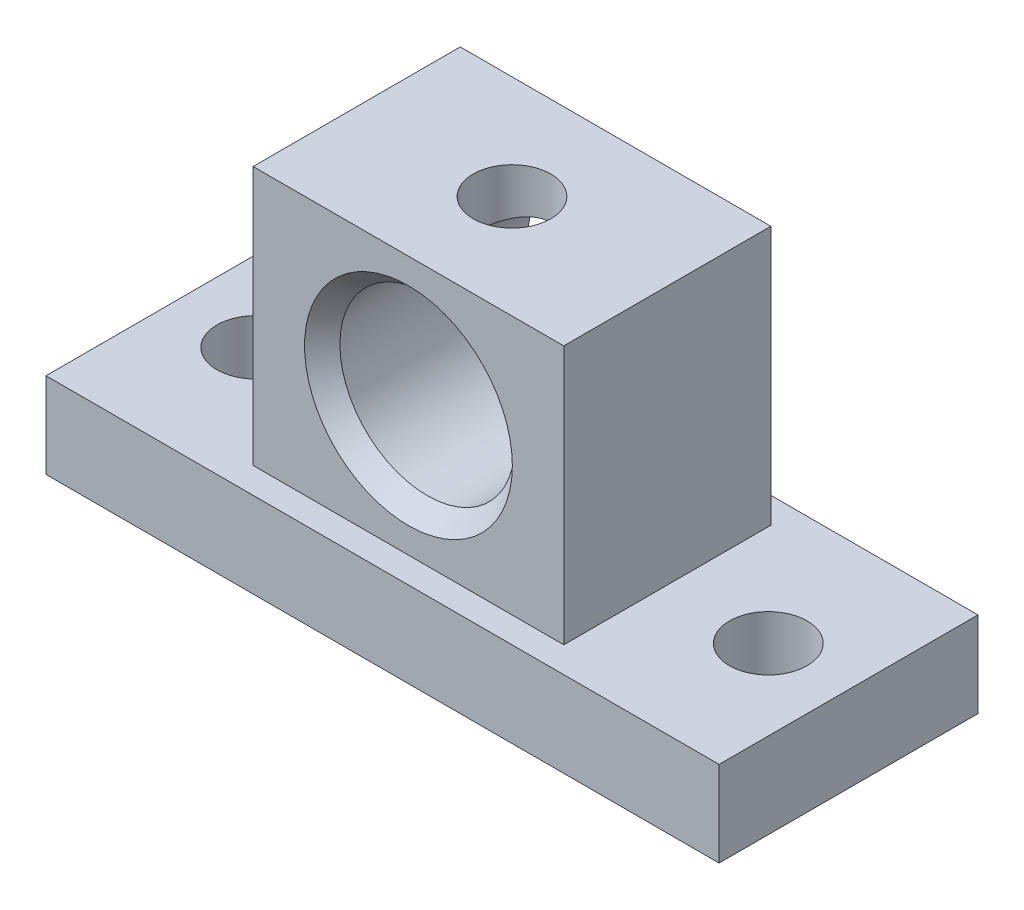
ISO-10303-21;
HEADER;
FILE_DESCRIPTION(('STEP AP214'),'2;1');
FILE_NAME('part.step','',(''),(''),'','','');
FILE_SCHEMA(('AUTOMOTIVE_DESIGN { 1 0 10303 214 1 1 1 1 }'));
ENDSEC;
DATA;
#1=APPLICATION_CONTEXT('core data for automotive mechanical design processes');
#2=APPLICATION_PROTOCOL_DEFINITION('international standard','automotive_design',2000,#1);
#3=PRODUCT_CONTEXT('',#1,'mechanical');
#4=PRODUCT('Part','Part','',(#3));
#5=PRODUCT_RELATED_PRODUCT_CATEGORY('part','',(#4));
#6=PRODUCT_DEFINITION_FORMATION('','',#4);
#7=PRODUCT_DEFINITION_CONTEXT('part definition',#1,'design');
#8=PRODUCT_DEFINITION('design','',#6,#7);
#9=PRODUCT_DEFINITION_SHAPE('','',#8);
#10=(LENGTH_UNIT() NAMED_UNIT(*) SI_UNIT(.MILLI.,.METRE.));
#11=(NAMED_UNIT(*) PLANE_ANGLE_UNIT() SI_UNIT($,.RADIAN.));
#12=(NAMED_UNIT(*) SI_UNIT($,.STERADIAN.) SOLID_ANGLE_UNIT());
#13=UNCERTAINTY_MEASURE_WITH_UNIT(LENGTH_MEASURE(1.E-05),#10,'distance_accuracy_value','');
#14=(GEOMETRIC_REPRESENTATION_CONTEXT(3) GLOBAL_UNCERTAINTY_ASSIGNED_CONTEXT((#13)) GLOBAL_UNIT_ASSIGNED_CONTEXT((#10,
#11,#12)) REPRESENTATION_CONTEXT('',''));
#15=CARTESIAN_POINT('',(0.,0.,0.));
#16=DIRECTION('',(0.,0.,1.));
#17=DIRECTION('',(1.,0.,0.));
#18=AXIS2_PLACEMENT_3D('',#15,#16,#17);
#19=CARTESIAN_POINT('',(0.,3.302,0.));
#20=DIRECTION('',(0.,-1.,0.));
#21=DIRECTION('',(0.,0.,-1.));
#22=AXIS2_PLACEMENT_3D('',#19,#20,#21);
#23=PLANE('',#22);
#24=CARTESIAN_POINT('',(9.9,3.302,0.));
#25=DIRECTION('',(0.,1.,0.));
#26=DIRECTION('',(0.,0.,1.));
#27=AXIS2_PLACEMENT_3D('',#24,#25,#26);
#28=CIRCLE('',#27,1.5);
#29=CARTESIAN_POINT('',(9.9,3.302,-1.5));
#30=VERTEX_POINT('',#29);
#31=EDGE_CURVE('E147',#30,#30,#28,.T.);
#32=ORIENTED_EDGE('',*,*,#31,.F.);
#33=EDGE_LOOP('',(#32));
#34=FACE_BOUND('',#33,.T.);
#35=CARTESIAN_POINT('',(-9.9,3.302,0.));
#36=DIRECTION('',(0.,1.,0.));
#37=DIRECTION('',(0.,0.,1.));
#38=AXIS2_PLACEMENT_3D('',#35,#36,#37);
#39=CIRCLE('',#38,1.5);
#40=CARTESIAN_POINT('',(-9.9,3.302,-1.5));
#41=VERTEX_POINT('',#40);
#42=EDGE_CURVE('E157',#41,#41,#39,.T.);
#43=ORIENTED_EDGE('',*,*,#42,.F.);
#44=EDGE_LOOP('',(#43));
#45=FACE_BOUND('',#44,.T.);
#46=DIRECTION('',(0.,0.,-1.));
#47=VECTOR('',#46,1.);
#48=CARTESIAN_POINT('',(13.,3.302,5.));
#49=LINE('',#48,#47);
#50=CARTESIAN_POINT('',(13.,3.302,5.));
#51=VERTEX_POINT('',#50);
#52=CARTESIAN_POINT('',(13.,3.302,-5.));
#53=VERTEX_POINT('',#52);
#54=EDGE_CURVE('E165',#51,#53,#49,.T.);
#55=ORIENTED_EDGE('',*,*,#54,.T.);
#56=DIRECTION('',(-1.,0.,0.));
#57=VECTOR('',#56,1.);
#58=CARTESIAN_POINT('',(-13.,3.302,-5.));
#59=LINE('',#58,#57);
#60=CARTESIAN_POINT('',(-13.,3.302,-5.));
#61=VERTEX_POINT('',#60);
#62=EDGE_CURVE('E169',#53,#61,#59,.T.);
#63=ORIENTED_EDGE('',*,*,#62,.T.);
#64=DIRECTION('',(0.,0.,1.));
#65=VECTOR('',#64,1.);
#66=CARTESIAN_POINT('',(-13.,3.302,5.));
#67=LINE('',#66,#65);
#68=CARTESIAN_POINT('',(-13.,3.302,5.));
#69=VERTEX_POINT('',#68);
#70=EDGE_CURVE('E173',#61,#69,#67,.T.);
#71=ORIENTED_EDGE('',*,*,#70,.T.);
#72=DIRECTION('',(1.,0.,0.));
#73=VECTOR('',#72,1.);
#74=CARTESIAN_POINT('',(-13.,3.302,5.));
#75=LINE('',#74,#73);
#76=EDGE_CURVE('E176',#69,#51,#75,.T.);
#77=ORIENTED_EDGE('',*,*,#76,.T.);
#78=EDGE_LOOP('',(#55,#63,#71,#77));
#79=FACE_BOUND('',#78,.T.);
#80=DIRECTION('',(0.,0.,-1.));
#81=VECTOR('',#80,1.);
#82=CARTESIAN_POINT('',(6.,3.302,-4.));
#83=LINE('',#82,#81);
#84=CARTESIAN_POINT('',(6.,3.302,4.));
#85=VERTEX_POINT('',#84);
#86=CARTESIAN_POINT('',(6.,3.302,-4.));
#87=VERTEX_POINT('',#86);
#88=EDGE_CURVE('E140',#85,#87,#83,.T.);
#89=ORIENTED_EDGE('',*,*,#88,.F.);
#90=DIRECTION('',(1.,0.,0.));
#91=VECTOR('',#90,1.);
#92=CARTESIAN_POINT('',(-6.,3.302,4.));
#93=LINE('',#92,#91);
#94=CARTESIAN_POINT('',(-6.,3.302,4.));
#95=VERTEX_POINT('',#94);
#96=EDGE_CURVE('E137',#95,#85,#93,.T.);
#97=ORIENTED_EDGE('',*,*,#96,.F.);
#98=DIRECTION('',(0.,0.,1.));
#99=VECTOR('',#98,1.);
#100=CARTESIAN_POINT('',(-6.,3.302,-4.));
#101=LINE('',#100,#99);
#102=CARTESIAN_POINT('',(-6.,3.302,-4.));
#103=VERTEX_POINT('',#102);
#104=EDGE_CURVE('E73',#103,#95,#101,.T.);
#105=ORIENTED_EDGE('',*,*,#104,.F.);
#106=DIRECTION('',(-1.,0.,0.));
#107=VECTOR('',#106,1.);
#108=CARTESIAN_POINT('',(-6.,3.302,-4.));
#109=LINE('',#108,#107);
#110=EDGE_CURVE('E68',#87,#103,#109,.T.);
#111=ORIENTED_EDGE('',*,*,#110,.F.);
#112=EDGE_LOOP('',(#89,#97,#105,#111));
#113=FACE_BOUND('',#112,.T.);
#114=ADVANCED_FACE('F45',(#34,#45,#79,#113),#23,.F.);
#115=CARTESIAN_POINT('',(0.,0.,0.));
#116=DIRECTION('',(0.,-1.,0.));
#117=DIRECTION('',(0.,0.,-1.));
#118=AXIS2_PLACEMENT_3D('',#115,#116,#117);
#119=PLANE('',#118);
#120=CARTESIAN_POINT('',(-9.9,0.,0.));
#121=DIRECTION('',(0.,1.,0.));
#122=DIRECTION('',(0.,0.,1.));
#123=AXIS2_PLACEMENT_3D('',#120,#121,#122);
#124=CIRCLE('',#123,1.5);
#125=CARTESIAN_POINT('',(-9.9,0.,-1.5));
#126=VERTEX_POINT('',#125);
#127=EDGE_CURVE('E155',#126,#126,#124,.T.);
#128=ORIENTED_EDGE('',*,*,#127,.T.);
#129=EDGE_LOOP('',(#128));
#130=FACE_BOUND('',#129,.T.);
#131=DIRECTION('',(0.,0.,-1.));
#132=VECTOR('',#131,1.);
#133=CARTESIAN_POINT('',(13.,0.,5.));
#134=LINE('',#133,#132);
#135=CARTESIAN_POINT('',(13.,0.,5.));
#136=VERTEX_POINT('',#135);
#137=CARTESIAN_POINT('',(13.,0.,-5.));
#138=VERTEX_POINT('',#137);
#139=EDGE_CURVE('E161',#136,#138,#134,.T.);
#140=ORIENTED_EDGE('',*,*,#139,.F.);
#141=DIRECTION('',(1.,0.,0.));
#142=VECTOR('',#141,1.);
#143=CARTESIAN_POINT('',(-13.,0.,5.));
#144=LINE('',#143,#142);
#145=CARTESIAN_POINT('',(-13.,0.,5.));
#146=VERTEX_POINT('',#145);
#147=EDGE_CURVE('E170',#146,#136,#144,.T.);
#148=ORIENTED_EDGE('',*,*,#147,.F.);
#149=DIRECTION('',(0.,0.,1.));
#150=VECTOR('',#149,1.);
#151=CARTESIAN_POINT('',(-13.,0.,5.));
#152=LINE('',#151,#150);
#153=CARTESIAN_POINT('',(-13.,0.,-5.));
#154=VERTEX_POINT('',#153);
#155=EDGE_CURVE('E186',#154,#146,#152,.T.);
#156=ORIENTED_EDGE('',*,*,#155,.F.);
#157=DIRECTION('',(-1.,0.,0.));
#158=VECTOR('',#157,1.);
#159=CARTESIAN_POINT('',(-13.,0.,-5.));
#160=LINE('',#159,#158);
#161=EDGE_CURVE('E183',#138,#154,#160,.T.);
#162=ORIENTED_EDGE('',*,*,#161,.F.);
#163=EDGE_LOOP('',(#140,#148,#156,#162));
#164=FACE_BOUND('',#163,.T.);
#165=CARTESIAN_POINT('',(9.9,0.,0.));
#166=DIRECTION('',(0.,1.,0.));
#167=DIRECTION('',(0.,0.,1.));
#168=AXIS2_PLACEMENT_3D('',#165,#166,#167);
#169=CIRCLE('',#168,1.5);
#170=CARTESIAN_POINT('',(9.9,0.,-1.5));
#171=VERTEX_POINT('',#170);
#172=EDGE_CURVE('E142',#171,#171,#169,.T.);
#173=ORIENTED_EDGE('',*,*,#172,.T.);
#174=EDGE_LOOP('',(#173));
#175=FACE_BOUND('',#174,.T.);
#176=ADVANCED_FACE('F250',(#130,#164,#175),#119,.T.);
#177=CARTESIAN_POINT('',(13.,3.302,5.));
#178=DIRECTION('',(-1.,0.,0.));
#179=DIRECTION('',(0.,0.,1.));
#180=AXIS2_PLACEMENT_3D('',#177,#178,#179);
#181=PLANE('',#180);
#182=ORIENTED_EDGE('',*,*,#139,.T.);
#183=DIRECTION('',(0.,-1.,0.));
#184=VECTOR('',#183,1.);
#185=CARTESIAN_POINT('',(13.,3.302,-5.));
#186=LINE('',#185,#184);
#187=EDGE_CURVE('E11',#53,#138,#186,.T.);
#188=ORIENTED_EDGE('',*,*,#187,.F.);
#189=ORIENTED_EDGE('',*,*,#54,.F.);
#190=DIRECTION('',(0.,-1.,0.));
#191=VECTOR('',#190,1.);
#192=CARTESIAN_POINT('',(13.,3.302,5.));
#193=LINE('',#192,#191);
#194=EDGE_CURVE('E179',#51,#136,#193,.T.);
#195=ORIENTED_EDGE('',*,*,#194,.T.);
#196=EDGE_LOOP('',(#182,#188,#189,#195));
#197=FACE_BOUND('',#196,.T.);
#198=ADVANCED_FACE('F47',(#197),#181,.F.);
#199=CARTESIAN_POINT('',(-13.,3.302,-5.));
#200=DIRECTION('',(0.,0.,1.));
#201=DIRECTION('',(1.,0.,0.));
#202=AXIS2_PLACEMENT_3D('',#199,#200,#201);
#203=PLANE('',#202);
#204=ORIENTED_EDGE('',*,*,#161,.T.);
#205=DIRECTION('',(0.,-1.,0.));
#206=VECTOR('',#205,1.);
#207=CARTESIAN_POINT('',(-13.,3.302,-5.));
#208=LINE('',#207,#206);
#209=EDGE_CURVE('E60',#61,#154,#208,.T.);
#210=ORIENTED_EDGE('',*,*,#209,.F.);
#211=ORIENTED_EDGE('',*,*,#62,.F.);
#212=ORIENTED_EDGE('',*,*,#187,.T.);
#213=EDGE_LOOP('',(#204,#210,#211,#212));
#214=FACE_BOUND('',#213,.T.);
#215=ADVANCED_FACE('F271',(#214),#203,.F.);
#216=CARTESIAN_POINT('',(-13.,3.302,5.));
#217=DIRECTION('',(1.,0.,0.));
#218=DIRECTION('',(0.,0.,-1.));
#219=AXIS2_PLACEMENT_3D('',#216,#217,#218);
#220=PLANE('',#219);
#221=ORIENTED_EDGE('',*,*,#155,.T.);
#222=DIRECTION('',(0.,-1.,0.));
#223=VECTOR('',#222,1.);
#224=CARTESIAN_POINT('',(-13.,3.302,5.));
#225=LINE('',#224,#223);
#226=EDGE_CURVE('E194',#69,#146,#225,.T.);
#227=ORIENTED_EDGE('',*,*,#226,.F.);
#228=ORIENTED_EDGE('',*,*,#70,.F.);
#229=ORIENTED_EDGE('',*,*,#209,.T.);
#230=EDGE_LOOP('',(#221,#227,#228,#229));
#231=FACE_BOUND('',#230,.T.);
#232=ADVANCED_FACE('F268',(#231),#220,.F.);
#233=CARTESIAN_POINT('',(-13.,3.302,5.));
#234=DIRECTION('',(0.,0.,-1.));
#235=DIRECTION('',(-1.,0.,0.));
#236=AXIS2_PLACEMENT_3D('',#233,#234,#235);
#237=PLANE('',#236);
#238=ORIENTED_EDGE('',*,*,#147,.T.);
#239=ORIENTED_EDGE('',*,*,#194,.F.);
#240=ORIENTED_EDGE('',*,*,#76,.F.);
#241=ORIENTED_EDGE('',*,*,#226,.T.);
#242=EDGE_LOOP('',(#238,#239,#240,#241));
#243=FACE_BOUND('',#242,.T.);
#244=ADVANCED_FACE('F265',(#243),#237,.F.);
#245=CARTESIAN_POINT('',(-9.9,3.302,0.));
#246=DIRECTION('',(0.,-1.,0.));
#247=DIRECTION('',(0.,0.,-1.));
#248=AXIS2_PLACEMENT_3D('',#245,#246,#247);
#249=CYLINDRICAL_SURFACE('',#248,1.5);
#250=CARTESIAN_POINT('',(-9.9,3.302,-1.5));
#251=CARTESIAN_POINT('',(-9.9,3.26760416666667,-1.5));
#252=CARTESIAN_POINT('',(-9.9,3.23320833333333,-1.5));
#253=CARTESIAN_POINT('',(-9.9,3.16441666666667,-1.5));
#254=CARTESIAN_POINT('',(-9.9,3.13002083333333,-1.5));
#255=CARTESIAN_POINT('',(-9.9,3.06122916666667,-1.5));
#256=CARTESIAN_POINT('',(-9.9,3.02683333333333,-1.5));
#257=CARTESIAN_POINT('',(-9.9,2.95804166666667,-1.5));
#258=CARTESIAN_POINT('',(-9.9,2.92364583333333,-1.5));
#259=CARTESIAN_POINT('',(-9.9,2.85485416666667,-1.5));
#260=CARTESIAN_POINT('',(-9.9,2.82045833333333,-1.5));
#261=CARTESIAN_POINT('',(-9.9,2.75166666666667,-1.5));
#262=CARTESIAN_POINT('',(-9.9,2.71727083333333,-1.5));
#263=CARTESIAN_POINT('',(-9.9,2.64847916666667,-1.5));
#264=CARTESIAN_POINT('',(-9.9,2.61408333333333,-1.5));
#265=CARTESIAN_POINT('',(-9.9,2.54529166666667,-1.5));
#266=CARTESIAN_POINT('',(-9.9,2.51089583333333,-1.5));
#267=CARTESIAN_POINT('',(-9.9,2.44210416666667,-1.5));
#268=CARTESIAN_POINT('',(-9.9,2.40770833333333,-1.5));
#269=CARTESIAN_POINT('',(-9.9,2.33891666666667,-1.5));
#270=CARTESIAN_POINT('',(-9.9,2.30452083333333,-1.5));
#271=CARTESIAN_POINT('',(-9.9,2.23572916666667,-1.5));
#272=CARTESIAN_POINT('',(-9.9,2.20133333333333,-1.5));
#273=CARTESIAN_POINT('',(-9.9,2.13254166666667,-1.5));
#274=CARTESIAN_POINT('',(-9.9,2.09814583333333,-1.5));
#275=CARTESIAN_POINT('',(-9.9,2.02935416666667,-1.5));
#276=CARTESIAN_POINT('',(-9.9,1.99495833333333,-1.5));
#277=CARTESIAN_POINT('',(-9.9,1.92616666666667,-1.5));
#278=CARTESIAN_POINT('',(-9.9,1.89177083333333,-1.5));
#279=CARTESIAN_POINT('',(-9.9,1.82297916666667,-1.5));
#280=CARTESIAN_POINT('',(-9.9,1.78858333333333,-1.5));
#281=CARTESIAN_POINT('',(-9.9,1.71979166666667,-1.5));
#282=CARTESIAN_POINT('',(-9.9,1.68539583333333,-1.5));
#283=CARTESIAN_POINT('',(-9.9,1.61660416666667,-1.5));
#284=CARTESIAN_POINT('',(-9.9,1.58220833333333,-1.5));
#285=CARTESIAN_POINT('',(-9.9,1.51341666666667,-1.5));
#286=CARTESIAN_POINT('',(-9.9,1.47902083333333,-1.5));
#287=CARTESIAN_POINT('',(-9.9,1.41022916666667,-1.5));
#288=CARTESIAN_POINT('',(-9.9,1.37583333333333,-1.5));
#289=CARTESIAN_POINT('',(-9.9,1.30704166666667,-1.5));
#290=CARTESIAN_POINT('',(-9.9,1.27264583333333,-1.5));
#291=CARTESIAN_POINT('',(-9.9,1.20385416666667,-1.5));
#292=CARTESIAN_POINT('',(-9.9,1.16945833333333,-1.5));
#293=CARTESIAN_POINT('',(-9.9,1.10066666666667,-1.5));
#294=CARTESIAN_POINT('',(-9.9,1.06627083333333,-1.5));
#295=CARTESIAN_POINT('',(-9.9,0.997479166666666,-1.5));
#296=CARTESIAN_POINT('',(-9.9,0.963083333333333,-1.5));
#297=CARTESIAN_POINT('',(-9.9,0.894291666666666,-1.5));
#298=CARTESIAN_POINT('',(-9.9,0.859895833333333,-1.5));
#299=CARTESIAN_POINT('',(-9.9,0.791104166666666,-1.5));
#300=CARTESIAN_POINT('',(-9.9,0.756708333333333,-1.5));
#301=CARTESIAN_POINT('',(-9.9,0.687916666666667,-1.5));
#302=CARTESIAN_POINT('',(-9.9,0.653520833333333,-1.5));
#303=CARTESIAN_POINT('',(-9.9,0.584729166666667,-1.5));
#304=CARTESIAN_POINT('',(-9.9,0.550333333333333,-1.5));
#305=CARTESIAN_POINT('',(-9.9,0.481541666666667,-1.5));
#306=CARTESIAN_POINT('',(-9.9,0.447145833333333,-1.5));
#307=CARTESIAN_POINT('',(-9.9,0.378354166666667,-1.5));
#308=CARTESIAN_POINT('',(-9.9,0.343958333333333,-1.5));
#309=CARTESIAN_POINT('',(-9.9,0.275166666666667,-1.5));
#310=CARTESIAN_POINT('',(-9.9,0.240770833333333,-1.5));
#311=CARTESIAN_POINT('',(-9.9,0.171979166666667,-1.5));
#312=CARTESIAN_POINT('',(-9.9,0.137583333333333,-1.5));
#313=CARTESIAN_POINT('',(-9.9,0.0687916666666666,-1.5));
#314=CARTESIAN_POINT('',(-9.9,0.0343958333333333,-1.5));
#315=CARTESIAN_POINT('',(-9.9,0.,-1.5));
#316=B_SPLINE_CURVE_WITH_KNOTS('',3,(#250,#251,#252,#253,#254,#255,#256,#257,#258,#259,#260,
#261,#262,#263,#264,#265,#266,#267,#268,#269,#270,#271,#272,#273,#274,#275,#276,#277,#278,#279,
#280,#281,#282,#283,#284,#285,#286,#287,#288,#289,#290,#291,#292,#293,#294,#295,#296,#297,#298,
#299,#300,#301,#302,#303,#304,#305,#306,#307,#308,#309,#310,#311,#312,#313,#314,#315),
.UNSPECIFIED.,.F.,.F.,(4,2,2,2,2,2,2,2,2,2,2,2,2,2,2,2,2,2,2,2,2,2,2,2,2,2,2,2,2,2,2,2,4),(0.,
0.1031875,0.206375,0.3095625,0.41275,0.5159375,0.619125,0.7223125,0.8255,0.9286875,1.031875,
1.1350625,1.23825,1.3414375,1.444625,1.5478125,1.651,1.7541875,1.857375,1.9605625,2.06375,
2.1669375,2.270125,2.3733125,2.4765,2.5796875,2.682875,2.7860625,2.88925,2.9924375,3.095625,
3.1988125,3.302),.UNSPECIFIED.);
#317=EDGE_CURVE('BSEAM262',#41,#126,#316,.T.);
#318=ORIENTED_EDGE('',*,*,#42,.T.);
#319=ORIENTED_EDGE('',*,*,#127,.F.);
#320=ORIENTED_EDGE('',*,*,#317,.T.);
#321=ORIENTED_EDGE('',*,*,#317,.F.);
#322=EDGE_LOOP('',(#318,#320,#319,#321));
#323=FACE_BOUND('',#322,.T.);
#324=ADVANCED_FACE('F262',(#323),#249,.F.);
#325=CARTESIAN_POINT('',(9.9,3.302,0.));
#326=DIRECTION('',(0.,-1.,0.));
#327=DIRECTION('',(0.,0.,-1.));
#328=AXIS2_PLACEMENT_3D('',#325,#326,#327);
#329=CYLINDRICAL_SURFACE('',#328,1.5);
#330=CARTESIAN_POINT('',(9.9,3.302,-1.5));
#331=CARTESIAN_POINT('',(9.9,3.26760416666667,-1.5));
#332=CARTESIAN_POINT('',(9.9,3.23320833333333,-1.5));
#333=CARTESIAN_POINT('',(9.9,3.16441666666667,-1.5));
#334=CARTESIAN_POINT('',(9.9,3.13002083333333,-1.5));
#335=CARTESIAN_POINT('',(9.9,3.06122916666667,-1.5));
#336=CARTESIAN_POINT('',(9.9,3.02683333333333,-1.5));
#337=CARTESIAN_POINT('',(9.9,2.95804166666667,-1.5));
#338=CARTESIAN_POINT('',(9.9,2.92364583333333,-1.5));
#339=CARTESIAN_POINT('',(9.9,2.85485416666667,-1.5));
#340=CARTESIAN_POINT('',(9.9,2.82045833333333,-1.5));
#341=CARTESIAN_POINT('',(9.9,2.75166666666667,-1.5));
#342=CARTESIAN_POINT('',(9.9,2.71727083333333,-1.5));
#343=CARTESIAN_POINT('',(9.9,2.64847916666667,-1.5));
#344=CARTESIAN_POINT('',(9.9,2.61408333333333,-1.5));
#345=CARTESIAN_POINT('',(9.9,2.54529166666667,-1.5));
#346=CARTESIAN_POINT('',(9.9,2.51089583333333,-1.5));
#347=CARTESIAN_POINT('',(9.9,2.44210416666667,-1.5));
#348=CARTESIAN_POINT('',(9.9,2.40770833333333,-1.5));
#349=CARTESIAN_POINT('',(9.9,2.33891666666667,-1.5));
#350=CARTESIAN_POINT('',(9.9,2.30452083333333,-1.5));
#351=CARTESIAN_POINT('',(9.9,2.23572916666667,-1.5));
#352=CARTESIAN_POINT('',(9.9,2.20133333333333,-1.5));
#353=CARTESIAN_POINT('',(9.9,2.13254166666667,-1.5));
#354=CARTESIAN_POINT('',(9.9,2.09814583333333,-1.5));
#355=CARTESIAN_POINT('',(9.9,2.02935416666667,-1.5));
#356=CARTESIAN_POINT('',(9.9,1.99495833333333,-1.5));
#357=CARTESIAN_POINT('',(9.9,1.92616666666667,-1.5));
#358=CARTESIAN_POINT('',(9.9,1.89177083333333,-1.5));
#359=CARTESIAN_POINT('',(9.9,1.82297916666667,-1.5));
#360=CARTESIAN_POINT('',(9.9,1.78858333333333,-1.5));
#361=CARTESIAN_POINT('',(9.9,1.71979166666667,-1.5));
#362=CARTESIAN_POINT('',(9.9,1.68539583333333,-1.5));
#363=CARTESIAN_POINT('',(9.9,1.61660416666667,-1.5));
#364=CARTESIAN_POINT('',(9.9,1.58220833333333,-1.5));
#365=CARTESIAN_POINT('',(9.9,1.51341666666667,-1.5));
#366=CARTESIAN_POINT('',(9.9,1.47902083333333,-1.5));
#367=CARTESIAN_POINT('',(9.9,1.41022916666667,-1.5));
#368=CARTESIAN_POINT('',(9.9,1.37583333333333,-1.5));
#369=CARTESIAN_POINT('',(9.9,1.30704166666667,-1.5));
#370=CARTESIAN_POINT('',(9.9,1.27264583333333,-1.5));
#371=CARTESIAN_POINT('',(9.9,1.20385416666667,-1.5));
#372=CARTESIAN_POINT('',(9.9,1.16945833333333,-1.5));
#373=CARTESIAN_POINT('',(9.9,1.10066666666667,-1.5));
#374=CARTESIAN_POINT('',(9.9,1.06627083333333,-1.5));
#375=CARTESIAN_POINT('',(9.9,0.997479166666666,-1.5));
#376=CARTESIAN_POINT('',(9.9,0.963083333333333,-1.5));
#377=CARTESIAN_POINT('',(9.9,0.894291666666666,-1.5));
#378=CARTESIAN_POINT('',(9.9,0.859895833333333,-1.5));
#379=CARTESIAN_POINT('',(9.9,0.791104166666666,-1.5));
#380=CARTESIAN_POINT('',(9.9,0.756708333333333,-1.5));
#381=CARTESIAN_POINT('',(9.9,0.687916666666667,-1.5));
#382=CARTESIAN_POINT('',(9.9,0.653520833333333,-1.5));
#383=CARTESIAN_POINT('',(9.9,0.584729166666667,-1.5));
#384=CARTESIAN_POINT('',(9.9,0.550333333333333,-1.5));
#385=CARTESIAN_POINT('',(9.9,0.481541666666667,-1.5));
#386=CARTESIAN_POINT('',(9.9,0.447145833333333,-1.5));
#387=CARTESIAN_POINT('',(9.9,0.378354166666667,-1.5));
#388=CARTESIAN_POINT('',(9.9,0.343958333333333,-1.5));
#389=CARTESIAN_POINT('',(9.9,0.275166666666667,-1.5));
#390=CARTESIAN_POINT('',(9.9,0.240770833333333,-1.5));
#391=CARTESIAN_POINT('',(9.9,0.171979166666667,-1.5));
#392=CARTESIAN_POINT('',(9.9,0.137583333333333,-1.5));
#393=CARTESIAN_POINT('',(9.9,0.0687916666666666,-1.5));
#394=CARTESIAN_POINT('',(9.9,0.0343958333333333,-1.5));
#395=CARTESIAN_POINT('',(9.9,0.,-1.5));
#396=B_SPLINE_CURVE_WITH_KNOTS('',3,(#330,#331,#332,#333,#334,#335,#336,#337,#338,#339,#340,
#341,#342,#343,#344,#345,#346,#347,#348,#349,#350,#351,#352,#353,#354,#355,#356,#357,#358,#359,
#360,#361,#362,#363,#364,#365,#366,#367,#368,#369,#370,#371,#372,#373,#374,#375,#376,#377,#378,
#379,#380,#381,#382,#383,#384,#385,#386,#387,#388,#389,#390,#391,#392,#393,#394,#395),
.UNSPECIFIED.,.F.,.F.,(4,2,2,2,2,2,2,2,2,2,2,2,2,2,2,2,2,2,2,2,2,2,2,2,2,2,2,2,2,2,2,2,4),(0.,
0.1031875,0.206375,0.3095625,0.41275,0.5159375,0.619125,0.7223125,0.8255,0.9286875,1.031875,
1.1350625,1.23825,1.3414375,1.444625,1.5478125,1.651,1.7541875,1.857375,1.9605625,2.06375,
2.1669375,2.270125,2.3733125,2.4765,2.5796875,2.682875,2.7860625,2.88925,2.9924375,3.095625,
3.1988125,3.302),.UNSPECIFIED.);
#397=EDGE_CURVE('BSEAM294',#30,#171,#396,.T.);
#398=ORIENTED_EDGE('',*,*,#31,.T.);
#399=ORIENTED_EDGE('',*,*,#172,.F.);
#400=ORIENTED_EDGE('',*,*,#397,.T.);
#401=ORIENTED_EDGE('',*,*,#397,.F.);
#402=EDGE_LOOP('',(#398,#400,#399,#401));
#403=FACE_BOUND('',#402,.T.);
#404=ADVANCED_FACE('F294',(#403),#329,.F.);
#405=CARTESIAN_POINT('',(6.,13.302,-4.));
#406=DIRECTION('',(-1.,0.,0.));
#407=DIRECTION('',(0.,0.,1.));
#408=AXIS2_PLACEMENT_3D('',#405,#406,#407);
#409=PLANE('',#408);
#410=ORIENTED_EDGE('',*,*,#88,.T.);
#411=DIRECTION('',(0.,-1.,0.));
#412=VECTOR('',#411,1.);
#413=CARTESIAN_POINT('',(6.,13.302,-4.));
#414=LINE('',#413,#412);
#415=CARTESIAN_POINT('',(6.,13.302,-4.));
#416=VERTEX_POINT('',#415);
#417=EDGE_CURVE('E119',#416,#87,#414,.T.);
#418=ORIENTED_EDGE('',*,*,#417,.F.);
#419=DIRECTION('',(0.,0.,-1.));
#420=VECTOR('',#419,1.);
#421=CARTESIAN_POINT('',(6.,13.302,-4.));
#422=LINE('',#421,#420);
#423=CARTESIAN_POINT('',(6.,13.302,4.));
#424=VERTEX_POINT('',#423);
#425=EDGE_CURVE('E127',#424,#416,#422,.T.);
#426=ORIENTED_EDGE('',*,*,#425,.F.);
#427=DIRECTION('',(0.,-1.,0.));
#428=VECTOR('',#427,1.);
#429=CARTESIAN_POINT('',(6.,13.302,4.));
#430=LINE('',#429,#428);
#431=EDGE_CURVE('E222',#424,#85,#430,.T.);
#432=ORIENTED_EDGE('',*,*,#431,.T.);
#433=EDGE_LOOP('',(#410,#418,#426,#432));
#434=FACE_BOUND('',#433,.T.);
#435=ADVANCED_FACE('F139',(#434),#409,.F.);
#436=CARTESIAN_POINT('',(-6.,13.302,-4.));
#437=DIRECTION('',(0.,0.,1.));
#438=DIRECTION('',(1.,0.,0.));
#439=AXIS2_PLACEMENT_3D('',#436,#437,#438);
#440=PLANE('',#439);
#441=CARTESIAN_POINT('',(0.,8.302,-4.));
#442=DIRECTION('',(0.,0.,1.));
#443=DIRECTION('',(1.,0.,0.));
#444=AXIS2_PLACEMENT_3D('',#441,#442,#443);
#445=CIRCLE('',#444,3.3782);
#446=CARTESIAN_POINT('',(3.3782,8.302,-4.));
#447=VERTEX_POINT('',#446);
#448=EDGE_CURVE('E200',#447,#447,#445,.T.);
#449=ORIENTED_EDGE('',*,*,#448,.T.);
#450=EDGE_LOOP('',(#449));
#451=FACE_BOUND('',#450,.T.);
#452=ORIENTED_EDGE('',*,*,#110,.T.);
#453=DIRECTION('',(0.,-1.,0.));
#454=VECTOR('',#453,1.);
#455=CARTESIAN_POINT('',(-6.,13.302,-4.));
#456=LINE('',#455,#454);
#457=CARTESIAN_POINT('',(-6.,13.302,-4.));
#458=VERTEX_POINT('',#457);
#459=EDGE_CURVE('E122',#458,#103,#456,.T.);
#460=ORIENTED_EDGE('',*,*,#459,.F.);
#461=DIRECTION('',(-1.,0.,0.));
#462=VECTOR('',#461,1.);
#463=CARTESIAN_POINT('',(-6.,13.302,-4.));
#464=LINE('',#463,#462);
#465=EDGE_CURVE('E115',#416,#458,#464,.T.);
#466=ORIENTED_EDGE('',*,*,#465,.F.);
#467=ORIENTED_EDGE('',*,*,#417,.T.);
#468=EDGE_LOOP('',(#452,#460,#466,#467));
#469=FACE_BOUND('',#468,.T.);
#470=ADVANCED_FACE('F117',(#451,#469),#440,.F.);
#471=CARTESIAN_POINT('',(-6.,13.302,-4.));
#472=DIRECTION('',(1.,0.,0.));
#473=DIRECTION('',(0.,0.,-1.));
#474=AXIS2_PLACEMENT_3D('',#471,#472,#473);
#475=PLANE('',#474);
#476=ORIENTED_EDGE('',*,*,#104,.T.);
#477=DIRECTION('',(0.,-1.,0.));
#478=VECTOR('',#477,1.);
#479=CARTESIAN_POINT('',(-6.,13.302,4.));
#480=LINE('',#479,#478);
#481=CARTESIAN_POINT('',(-6.,13.302,4.));
#482=VERTEX_POINT('',#481);
#483=EDGE_CURVE('E149',#482,#95,#480,.T.);
#484=ORIENTED_EDGE('',*,*,#483,.F.);
#485=DIRECTION('',(0.,0.,1.));
#486=VECTOR('',#485,1.);
#487=CARTESIAN_POINT('',(-6.,13.302,-4.));
#488=LINE('',#487,#486);
#489=EDGE_CURVE('E126',#458,#482,#488,.T.);
#490=ORIENTED_EDGE('',*,*,#489,.F.);
#491=ORIENTED_EDGE('',*,*,#459,.T.);
#492=EDGE_LOOP('',(#476,#484,#490,#491));
#493=FACE_BOUND('',#492,.T.);
#494=ADVANCED_FACE('F238',(#493),#475,.F.);
#495=CARTESIAN_POINT('',(-6.,13.302,4.));
#496=DIRECTION('',(0.,0.,-1.));
#497=DIRECTION('',(-1.,0.,0.));
#498=AXIS2_PLACEMENT_3D('',#495,#496,#497);
#499=PLANE('',#498);
#500=CARTESIAN_POINT('',(0.,8.302,4.));
#501=DIRECTION('',(0.,0.,1.));
#502=DIRECTION('',(1.,0.,0.));
#503=AXIS2_PLACEMENT_3D('',#500,#501,#502);
#504=CIRCLE('',#503,4.0132);
#505=CARTESIAN_POINT('',(4.0132,8.302,4.));
#506=VERTEX_POINT('',#505);
#507=EDGE_CURVE('E210',#506,#506,#504,.T.);
#508=ORIENTED_EDGE('',*,*,#507,.F.);
#509=EDGE_LOOP('',(#508));
#510=FACE_BOUND('',#509,.T.);
#511=ORIENTED_EDGE('',*,*,#96,.T.);
#512=ORIENTED_EDGE('',*,*,#431,.F.);
#513=DIRECTION('',(1.,0.,0.));
#514=VECTOR('',#513,1.);
#515=CARTESIAN_POINT('',(-6.,13.302,4.));
#516=LINE('',#515,#514);
#517=EDGE_CURVE('E132',#482,#424,#516,.T.);
#518=ORIENTED_EDGE('',*,*,#517,.F.);
#519=ORIENTED_EDGE('',*,*,#483,.T.);
#520=EDGE_LOOP('',(#511,#512,#518,#519));
#521=FACE_BOUND('',#520,.T.);
#522=ADVANCED_FACE('F236',(#510,#521),#499,.F.);
#523=CARTESIAN_POINT('',(0.,13.302,0.));
#524=DIRECTION('',(0.,1.,0.));
#525=DIRECTION('',(0.,0.,1.));
#526=AXIS2_PLACEMENT_3D('',#523,#524,#525);
#527=PLANE('',#526);
#528=CARTESIAN_POINT('',(0.,13.302,0.));
#529=DIRECTION('',(0.,1.,0.));
#530=DIRECTION('',(0.,0.,1.));
#531=AXIS2_PLACEMENT_3D('',#528,#529,#530);
#532=CIRCLE('',#531,1.5);
#533=CARTESIAN_POINT('',(0.,13.302,1.5));
#534=VERTEX_POINT('',#533);
#535=EDGE_CURVE('E409',#534,#534,#532,.T.);
#536=ORIENTED_EDGE('',*,*,#535,.F.);
#537=EDGE_LOOP('',(#536));
#538=FACE_BOUND('',#537,.T.);
#539=ORIENTED_EDGE('',*,*,#425,.T.);
#540=ORIENTED_EDGE('',*,*,#465,.T.);
#541=ORIENTED_EDGE('',*,*,#489,.T.);
#542=ORIENTED_EDGE('',*,*,#517,.T.);
#543=EDGE_LOOP('',(#539,#540,#541,#542));
#544=FACE_BOUND('',#543,.T.);
#545=ADVANCED_FACE('F130',(#538,#544),#527,.T.);
#546=CARTESIAN_POINT('',(0.,8.302,4.));
#547=DIRECTION('',(0.,0.,1.));
#548=DIRECTION('',(1.,0.,0.));
#549=AXIS2_PLACEMENT_3D('',#546,#547,#548);
#550=CYLINDRICAL_SURFACE('',#549,3.3782);
#551=CARTESIAN_POINT('',(0.,11.6802,1.5));
#552=CARTESIAN_POINT('',(0.0798761333153415,11.6801969534139,1.49999627580346));
#553=CARTESIAN_POINT('',(0.159877335676614,11.6773353798662,1.49358223755245));
#554=CARTESIAN_POINT('',(0.317578594186771,11.6661732763271,1.46818006611334));
#555=CARTESIAN_POINT('',(0.395272642154595,11.6578596595866,1.44916167705029));
#556=CARTESIAN_POINT('',(0.54582886593067,11.636676117362,1.3994042857669));
#557=CARTESIAN_POINT('',(0.618707193333675,11.6238224473821,1.36870706933055));
#558=CARTESIAN_POINT('',(0.758199448035334,11.5947878251746,1.29664996085639));
#559=CARTESIAN_POINT('',(0.824814805665684,11.5786076353578,1.25529251150578));
#560=CARTESIAN_POINT('',(0.953699000745382,11.5435087044212,1.16067608631345));
#561=CARTESIAN_POINT('',(1.01557602487934,11.5244926889438,1.10691986577415));
#562=CARTESIAN_POINT('',(1.12978168819009,11.4862522920434,0.99008759463987));
#563=CARTESIAN_POINT('',(1.18210464638526,11.4670277938036,0.927006039145791));
#564=CARTESIAN_POINT('',(1.2787102199906,11.4292961004808,0.788922872587686));
#565=CARTESIAN_POINT('',(1.32235609035129,11.4108940098097,0.713443947089989));
#566=CARTESIAN_POINT('',(1.39615811326426,11.3784613939229,0.555287914735523));
#567=CARTESIAN_POINT('',(1.42632212678062,11.3644283226836,0.472615036195983));
#568=CARTESIAN_POINT('',(1.47063219470845,11.3433899554619,0.306921624396552));
#569=CARTESIAN_POINT('',(1.48553667629567,11.33605411028,0.224147648687249));
#570=CARTESIAN_POINT('',(1.50126271695942,11.3283064675298,0.0569740302773082));
#571=CARTESIAN_POINT('',(1.50209365412325,11.3278900591095,-0.0274244923387655));
#572=CARTESIAN_POINT('',(1.49021476195885,11.3337525477779,-0.187388704525257));
#573=CARTESIAN_POINT('',(1.47870750414116,11.3394368710895,-0.263070127480943));
#574=CARTESIAN_POINT('',(1.44451666640886,11.3558438992389,-0.411289160874733));
#575=CARTESIAN_POINT('',(1.42183058108687,11.3665677335107,-0.483826062593536));
#576=CARTESIAN_POINT('',(1.36547659272499,11.3920939023977,-0.625643066404415));
#577=CARTESIAN_POINT('',(1.33157376009645,11.4069823301068,-0.694813611154574));
#578=CARTESIAN_POINT('',(1.25391758244464,11.4391467518075,-0.826775861100972));
#579=CARTESIAN_POINT('',(1.21016009350476,11.4564237490173,-0.889564866671604));
#580=CARTESIAN_POINT('',(1.1090535688293,11.4934578142906,-1.01340716086066));
#581=CARTESIAN_POINT('',(1.05079679171923,11.5132927051225,-1.07369836161453));
#582=CARTESIAN_POINT('',(0.924832385015516,11.5518086186307,-1.18393078351214));
#583=CARTESIAN_POINT('',(0.857121919082933,11.5704892925781,-1.23386888725755));
#584=CARTESIAN_POINT('',(0.711587254983548,11.6052758197701,-1.32330872482086));
#585=CARTESIAN_POINT('',(0.633524038863521,11.6212897063306,-1.3624600275476));
#586=CARTESIAN_POINT('',(0.471025559752945,11.6482118628399,-1.42679976655852));
#587=CARTESIAN_POINT('',(0.386594344308527,11.6591233446794,-1.45199698858272));
#588=CARTESIAN_POINT('',(0.22008928416291,11.6739859564818,-1.48602488166086));
#589=CARTESIAN_POINT('',(0.138262669930839,11.6783700014418,-1.49587575180594));
#590=CARTESIAN_POINT('',(-0.0259869536588823,11.6810970534103,-1.50202253990614));
#591=CARTESIAN_POINT('',(-0.108409751508082,11.6794421071498,-1.49832305033879));
#592=CARTESIAN_POINT('',(-0.266465270865678,11.670551563171,-1.47816658345565));
#593=CARTESIAN_POINT('',(-0.342214639533017,11.6636450164939,-1.46246154239003));
#594=CARTESIAN_POINT('',(-0.489898986343041,11.6453179121889,-1.41982694321819));
#595=CARTESIAN_POINT('',(-0.561833499406448,11.6338968056072,-1.39289602006433));
#596=CARTESIAN_POINT('',(-0.702395435047546,11.6071711645687,-1.32771622948317));
#597=CARTESIAN_POINT('',(-0.770849633397491,11.5917565771673,-1.28914043425533));
#598=CARTESIAN_POINT('',(-0.900560083100337,11.5586417093688,-1.20212221039257));
#599=CARTESIAN_POINT('',(-0.961813182500204,11.5409404351409,-1.1536754863779));
#600=CARTESIAN_POINT('',(-1.0805783594715,11.5033701960405,-1.04374932003952));
#601=CARTESIAN_POINT('',(-1.13739293036526,11.4834414116427,-0.981534914400328));
#602=CARTESIAN_POINT('',(-1.24000907125583,11.4448688823461,-0.848208161623083));
#603=CARTESIAN_POINT('',(-1.28580676061619,11.4262255919003,-0.777092692504941));
#604=CARTESIAN_POINT('',(-1.36599858507881,11.3920218056215,-0.625737323796864));
#605=CARTESIAN_POINT('',(-1.40010174055728,11.3765433809208,-0.545323255376071));
#606=CARTESIAN_POINT('',(-1.45395848647022,11.351448874829,-0.378982025375092));
#607=CARTESIAN_POINT('',(-1.47372608680575,11.3418270713408,-0.293060335947172));
#608=CARTESIAN_POINT('',(-1.49687409669686,11.3304904017886,-0.125973782774892));
#609=CARTESIAN_POINT('',(-1.50150002400837,11.3281751648738,-0.0450219280334039));
#610=CARTESIAN_POINT('',(-1.49764877522485,11.3300834552597,0.116481579421432));
#611=CARTESIAN_POINT('',(-1.48917437892051,11.3343055953782,0.197033313399091));
#612=CARTESIAN_POINT('',(-1.46045290102871,11.3482338864905,0.350434585258772));
#613=CARTESIAN_POINT('',(-1.44094186870537,11.357596181065,0.423456394211163));
#614=CARTESIAN_POINT('',(-1.39147676246817,11.380435580882,0.565181405948175));
#615=CARTESIAN_POINT('',(-1.36151967088587,11.3939138750187,0.633883354030455));
#616=CARTESIAN_POINT('',(-1.28981830459545,11.4245332516482,0.769836652625616));
#617=CARTESIAN_POINT('',(-1.24744211958414,11.441853602711,0.836713459118405));
#618=CARTESIAN_POINT('',(-1.15292734303441,11.4777752180269,0.962793819815419));
#619=CARTESIAN_POINT('',(-1.10078468379875,11.4963770139483,1.02199415935272));
#620=CARTESIAN_POINT('',(-0.9828387950007,11.5347125322653,1.13637556751142));
#621=CARTESIAN_POINT('',(-0.91624065843594,11.5544034257541,1.19075540957453));
#622=CARTESIAN_POINT('',(-0.774173034725279,11.5911134093197,1.28765164784788));
#623=CARTESIAN_POINT('',(-0.69869951891729,11.6081312778223,1.33016262683987));
#624=CARTESIAN_POINT('',(-0.541704635281957,11.6374302353425,1.40139342473488));
#625=CARTESIAN_POINT('',(-0.460262054594556,11.6497631305256,1.43026499274509));
#626=CARTESIAN_POINT('',(-0.293123314747337,11.6685016626886,1.47359635003239));
#627=CARTESIAN_POINT('',(-0.207440984875817,11.6749253840713,1.48810012098318));
#628=CARTESIAN_POINT('',(-0.101037807507011,11.6787498380598,1.49673094425814));
#629=CARTESIAN_POINT('',(-0.0808558315947645,11.6792927169073,1.49795569886868));
#630=CARTESIAN_POINT('',(-0.0404519115697641,11.6800181857415,1.49959070301489));
#631=CARTESIAN_POINT('',(-0.0202299670015722,11.6802007715989,1.50000094321508));
#632=CARTESIAN_POINT('',(0.,11.6802,1.5));
#633=B_SPLINE_CURVE_WITH_KNOTS('',3,(#551,#552,#553,#554,#555,#556,#557,#558,#559,#560,#561,
#562,#563,#564,#565,#566,#567,#568,#569,#570,#571,#572,#573,#574,#575,#576,#577,#578,#579,#580,
#581,#582,#583,#584,#585,#586,#587,#588,#589,#590,#591,#592,#593,#594,#595,#596,#597,#598,#599,
#600,#601,#602,#603,#604,#605,#606,#607,#608,#609,#610,#611,#612,#613,#614,#615,#616,#617,#618,
#619,#620,#621,#622,#623,#624,#625,#626,#627,#628,#629,#630,#631,#632),.UNSPECIFIED.,.T.,.F.,(4,
2,2,2,2,2,2,2,2,2,2,2,2,2,2,2,2,2,2,2,2,2,2,2,2,2,2,2,2,2,2,2,2,2,2,2,2,2,2,2,4),(0.,
0.239545230099174,0.479667564814487,0.718938722448181,0.95815510212082,1.2095042905139,
1.46100245139908,1.72698737629576,1.99281700845945,2.24467767781384,2.4963705099643,
2.72558703382677,2.95485495325335,3.1892658329624,3.42377546790556,3.68108205815764,
3.93846601326513,4.20342547261268,4.46821791850526,4.71451598646763,4.96073058700265,
5.19267301455546,5.42464365413314,5.66385234516186,5.90316535211821,6.16173283306443,
6.42039126006514,6.68508433199063,6.94951837386967,7.19156829273606,7.43356685746981,
7.661061018539,7.88862095287676,8.13075144325397,8.37298300516187,8.6363472263042,
8.89983145706878,9.16031084539733,9.41999038588061,9.48065852739198,9.54132736424164),.UNSPECIFIED.);
#634=CARTESIAN_POINT('',(0.,11.6802,1.5));
#635=VERTEX_POINT('',#634);
#636=EDGE_CURVE('E49',#635,#635,#633,.T.);
#637=ORIENTED_EDGE('',*,*,#636,.T.);
#638=EDGE_LOOP('',(#637));
#639=FACE_BOUND('',#638,.T.);
#640=CARTESIAN_POINT('',(0.,8.302,3.26951606141466));
#641=DIRECTION('',(0.,0.,1.));
#642=DIRECTION('',(1.,0.,0.));
#643=AXIS2_PLACEMENT_3D('',#640,#641,#642);
#644=CIRCLE('',#643,3.3782);
#645=CARTESIAN_POINT('',(3.3782,8.302,3.26951606141466));
#646=VERTEX_POINT('',#645);
#647=EDGE_CURVE('E203',#646,#646,#644,.T.);
#648=ORIENTED_EDGE('',*,*,#647,.T.);
#649=EDGE_LOOP('',(#648));
#650=FACE_BOUND('',#649,.T.);
#651=ORIENTED_EDGE('',*,*,#448,.F.);
#652=EDGE_LOOP('',(#651));
#653=FACE_BOUND('',#652,.T.);
#654=ADVANCED_FACE('F370',(#639,#650,#653),#550,.F.);
#655=CARTESIAN_POINT('',(0.,8.302,4.));
#656=DIRECTION('',(0.,0.,1.));
#657=DIRECTION('',(1.,0.,0.));
#658=AXIS2_PLACEMENT_3D('',#655,#656,#657);
#659=CONICAL_SURFACE('',#658,4.0132,0.715584993317675);
#660=ORIENTED_EDGE('',*,*,#647,.F.);
#661=EDGE_LOOP('',(#660));
#662=FACE_BOUND('',#661,.T.);
#663=ORIENTED_EDGE('',*,*,#507,.T.);
#664=EDGE_LOOP('',(#663));
#665=FACE_BOUND('',#664,.T.);
#666=ADVANCED_FACE('F379',(#662,#665),#659,.F.);
#667=CARTESIAN_POINT('',(0.,10.302,0.));
#668=DIRECTION('',(0.,1.,0.));
#669=DIRECTION('',(0.,0.,1.));
#670=AXIS2_PLACEMENT_3D('',#667,#668,#669);
#671=CYLINDRICAL_SURFACE('',#670,1.5);
#672=ORIENTED_EDGE('',*,*,#535,.T.);
#673=EDGE_LOOP('',(#672));
#674=FACE_BOUND('',#673,.T.);
#675=ORIENTED_EDGE('',*,*,#636,.F.);
#676=EDGE_LOOP('',(#675));
#677=FACE_BOUND('',#676,.T.);
#678=ADVANCED_FACE('F387',(#674,#677),#671,.F.);
#679=CLOSED_SHELL('',(#114,#176,#198,#215,#232,#244,#324,#404,#435,#470,#494,#522,#545,#654,
#666,#678));
#680=MANIFOLD_SOLID_BREP('B2',#679);
#681=ADVANCED_BREP_SHAPE_REPRESENTATION('',(#18,#680),#14);
#682=SHAPE_DEFINITION_REPRESENTATION(#9,#681);
ENDSEC;
END-ISO-10303-21;
